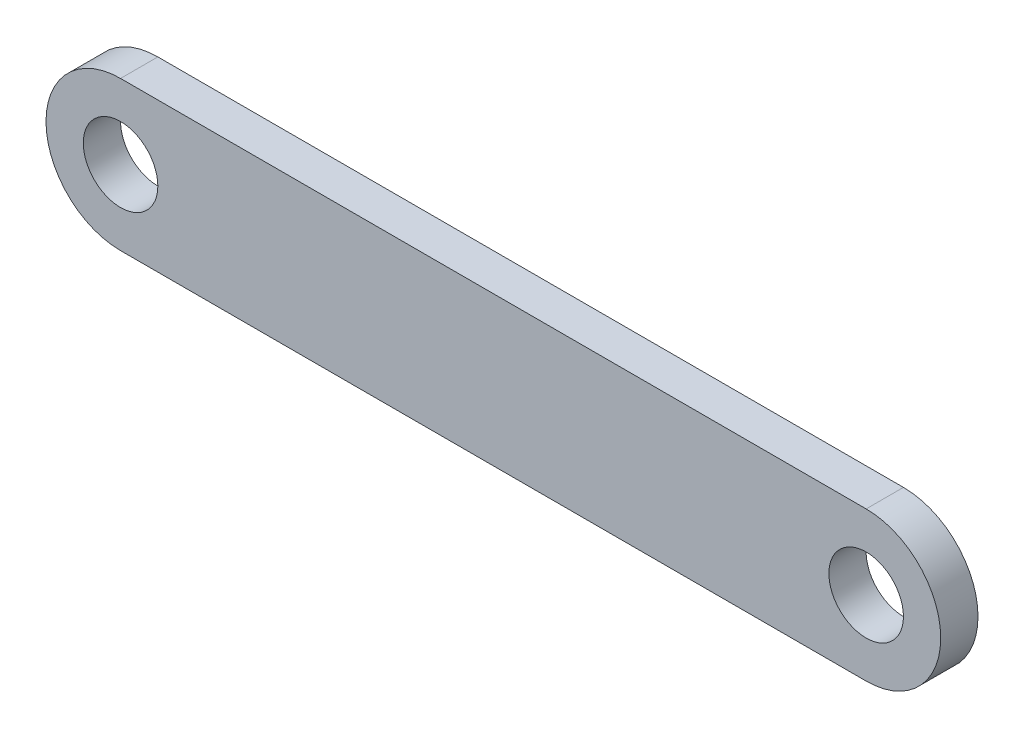
ISO-10303-21;
HEADER;
FILE_DESCRIPTION(('STEP AP214'),'2;1');
FILE_NAME('part.step','',(''),(''),'','','');
FILE_SCHEMA(('AUTOMOTIVE_DESIGN { 1 0 10303 214 1 1 1 1 }'));
ENDSEC;
DATA;
#1=APPLICATION_CONTEXT('core data for automotive mechanical design processes');
#2=APPLICATION_PROTOCOL_DEFINITION('international standard','automotive_design',2000,#1);
#3=PRODUCT_CONTEXT('',#1,'mechanical');
#4=PRODUCT('Part','Part','',(#3));
#5=PRODUCT_RELATED_PRODUCT_CATEGORY('part','',(#4));
#6=PRODUCT_DEFINITION_FORMATION('','',#4);
#7=PRODUCT_DEFINITION_CONTEXT('part definition',#1,'design');
#8=PRODUCT_DEFINITION('design','',#6,#7);
#9=PRODUCT_DEFINITION_SHAPE('','',#8);
#10=(LENGTH_UNIT() NAMED_UNIT(*) SI_UNIT(.MILLI.,.METRE.));
#11=(NAMED_UNIT(*) PLANE_ANGLE_UNIT() SI_UNIT($,.RADIAN.));
#12=(NAMED_UNIT(*) SI_UNIT($,.STERADIAN.) SOLID_ANGLE_UNIT());
#13=UNCERTAINTY_MEASURE_WITH_UNIT(LENGTH_MEASURE(1.E-05),#10,'distance_accuracy_value','');
#14=(GEOMETRIC_REPRESENTATION_CONTEXT(3) GLOBAL_UNCERTAINTY_ASSIGNED_CONTEXT((#13)) GLOBAL_UNIT_ASSIGNED_CONTEXT((#10,
#11,#12)) REPRESENTATION_CONTEXT('',''));
#15=CARTESIAN_POINT('',(0.,0.,0.));
#16=DIRECTION('',(0.,0.,1.));
#17=DIRECTION('',(1.,0.,0.));
#18=AXIS2_PLACEMENT_3D('',#15,#16,#17);
#19=CARTESIAN_POINT('',(-50.,0.,5.));
#20=DIRECTION('',(0.,0.,1.));
#21=DIRECTION('',(1.,0.,0.));
#22=AXIS2_PLACEMENT_3D('',#19,#20,#21);
#23=PLANE('',#22);
#24=CARTESIAN_POINT('',(-50.,0.,5.));
#25=DIRECTION('',(0.,0.,1.));
#26=DIRECTION('',(1.,0.,0.));
#27=AXIS2_PLACEMENT_3D('',#24,#25,#26);
#28=CIRCLE('',#27,5.);
#29=CARTESIAN_POINT('',(-45.,0.,5.));
#30=VERTEX_POINT('',#29);
#31=EDGE_CURVE('E118',#30,#30,#28,.T.);
#32=ORIENTED_EDGE('',*,*,#31,.F.);
#33=EDGE_LOOP('',(#32));
#34=FACE_BOUND('',#33,.T.);
#35=CARTESIAN_POINT('',(-50.,0.,5.));
#36=DIRECTION('',(0.,0.,1.));
#37=DIRECTION('',(1.,0.,0.));
#38=AXIS2_PLACEMENT_3D('',#35,#36,#37);
#39=CIRCLE('',#38,10.);
#40=CARTESIAN_POINT('',(-50.,10.,5.));
#41=VERTEX_POINT('',#40);
#42=CARTESIAN_POINT('',(-50.,-10.,5.));
#43=VERTEX_POINT('',#42);
#44=EDGE_CURVE('E97',#41,#43,#39,.T.);
#45=ORIENTED_EDGE('',*,*,#44,.T.);
#46=DIRECTION('',(1.,0.,0.));
#47=VECTOR('',#46,1.);
#48=CARTESIAN_POINT('',(-50.,-10.,5.));
#49=LINE('',#48,#47);
#50=CARTESIAN_POINT('',(50.,-10.,5.));
#51=VERTEX_POINT('',#50);
#52=EDGE_CURVE('E93',#43,#51,#49,.T.);
#53=ORIENTED_EDGE('',*,*,#52,.T.);
#54=CARTESIAN_POINT('',(50.,0.,5.));
#55=DIRECTION('',(0.,0.,1.));
#56=DIRECTION('',(1.,0.,0.));
#57=AXIS2_PLACEMENT_3D('',#54,#55,#56);
#58=CIRCLE('',#57,10.);
#59=CARTESIAN_POINT('',(50.,10.,5.));
#60=VERTEX_POINT('',#59);
#61=EDGE_CURVE('E96',#51,#60,#58,.T.);
#62=ORIENTED_EDGE('',*,*,#61,.T.);
#63=DIRECTION('',(-1.,0.,0.));
#64=VECTOR('',#63,1.);
#65=CARTESIAN_POINT('',(-50.,10.,5.));
#66=LINE('',#65,#64);
#67=EDGE_CURVE('E63',#60,#41,#66,.T.);
#68=ORIENTED_EDGE('',*,*,#67,.T.);
#69=EDGE_LOOP('',(#45,#53,#62,#68));
#70=FACE_BOUND('',#69,.T.);
#71=CARTESIAN_POINT('',(50.,0.,5.));
#72=DIRECTION('',(0.,0.,1.));
#73=DIRECTION('',(1.,0.,0.));
#74=AXIS2_PLACEMENT_3D('',#71,#72,#73);
#75=CIRCLE('',#74,5.);
#76=CARTESIAN_POINT('',(55.,0.,5.));
#77=VERTEX_POINT('',#76);
#78=EDGE_CURVE('E139',#77,#77,#75,.T.);
#79=ORIENTED_EDGE('',*,*,#78,.F.);
#80=EDGE_LOOP('',(#79));
#81=FACE_BOUND('',#80,.T.);
#82=ADVANCED_FACE('F44',(#34,#70,#81),#23,.T.);
#83=CARTESIAN_POINT('',(-50.,0.,0.));
#84=DIRECTION('',(0.,0.,1.));
#85=DIRECTION('',(1.,0.,0.));
#86=AXIS2_PLACEMENT_3D('',#83,#84,#85);
#87=PLANE('',#86);
#88=CARTESIAN_POINT('',(-50.,0.,0.));
#89=DIRECTION('',(0.,0.,1.));
#90=DIRECTION('',(1.,0.,0.));
#91=AXIS2_PLACEMENT_3D('',#88,#89,#90);
#92=CIRCLE('',#91,10.);
#93=CARTESIAN_POINT('',(-50.,10.,0.));
#94=VERTEX_POINT('',#93);
#95=CARTESIAN_POINT('',(-50.,-10.,0.));
#96=VERTEX_POINT('',#95);
#97=EDGE_CURVE('E114',#94,#96,#92,.T.);
#98=ORIENTED_EDGE('',*,*,#97,.F.);
#99=DIRECTION('',(-1.,0.,0.));
#100=VECTOR('',#99,1.);
#101=CARTESIAN_POINT('',(-50.,10.,0.));
#102=LINE('',#101,#100);
#103=CARTESIAN_POINT('',(50.,10.,0.));
#104=VERTEX_POINT('',#103);
#105=EDGE_CURVE('E86',#104,#94,#102,.T.);
#106=ORIENTED_EDGE('',*,*,#105,.F.);
#107=CARTESIAN_POINT('',(50.,0.,0.));
#108=DIRECTION('',(0.,0.,1.));
#109=DIRECTION('',(1.,0.,0.));
#110=AXIS2_PLACEMENT_3D('',#107,#108,#109);
#111=CIRCLE('',#110,10.);
#112=CARTESIAN_POINT('',(50.,-10.,0.));
#113=VERTEX_POINT('',#112);
#114=EDGE_CURVE('E79',#113,#104,#111,.T.);
#115=ORIENTED_EDGE('',*,*,#114,.F.);
#116=DIRECTION('',(1.,0.,0.));
#117=VECTOR('',#116,1.);
#118=CARTESIAN_POINT('',(-50.,-10.,0.));
#119=LINE('',#118,#117);
#120=EDGE_CURVE('E104',#96,#113,#119,.T.);
#121=ORIENTED_EDGE('',*,*,#120,.F.);
#122=EDGE_LOOP('',(#98,#106,#115,#121));
#123=FACE_BOUND('',#122,.T.);
#124=CARTESIAN_POINT('',(-50.,0.,0.));
#125=DIRECTION('',(0.,0.,1.));
#126=DIRECTION('',(1.,0.,0.));
#127=AXIS2_PLACEMENT_3D('',#124,#125,#126);
#128=CIRCLE('',#127,5.);
#129=CARTESIAN_POINT('',(-45.,0.,0.));
#130=VERTEX_POINT('',#129);
#131=EDGE_CURVE('E136',#130,#130,#128,.T.);
#132=ORIENTED_EDGE('',*,*,#131,.T.);
#133=EDGE_LOOP('',(#132));
#134=FACE_BOUND('',#133,.T.);
#135=CARTESIAN_POINT('',(50.,0.,0.));
#136=DIRECTION('',(0.,0.,1.));
#137=DIRECTION('',(1.,0.,0.));
#138=AXIS2_PLACEMENT_3D('',#135,#136,#137);
#139=CIRCLE('',#138,5.);
#140=CARTESIAN_POINT('',(55.,0.,0.));
#141=VERTEX_POINT('',#140);
#142=EDGE_CURVE('E143',#141,#141,#139,.T.);
#143=ORIENTED_EDGE('',*,*,#142,.T.);
#144=EDGE_LOOP('',(#143));
#145=FACE_BOUND('',#144,.T.);
#146=ADVANCED_FACE('F131',(#123,#134,#145),#87,.F.);
#147=CARTESIAN_POINT('',(-50.,0.,5.));
#148=DIRECTION('',(0.,0.,-1.));
#149=DIRECTION('',(-1.,0.,0.));
#150=AXIS2_PLACEMENT_3D('',#147,#148,#149);
#151=CYLINDRICAL_SURFACE('',#150,10.);
#152=ORIENTED_EDGE('',*,*,#97,.T.);
#153=DIRECTION('',(0.,0.,-1.));
#154=VECTOR('',#153,1.);
#155=CARTESIAN_POINT('',(-50.,-10.,5.));
#156=LINE('',#155,#154);
#157=EDGE_CURVE('E11',#43,#96,#156,.T.);
#158=ORIENTED_EDGE('',*,*,#157,.F.);
#159=ORIENTED_EDGE('',*,*,#44,.F.);
#160=DIRECTION('',(0.,0.,-1.));
#161=VECTOR('',#160,1.);
#162=CARTESIAN_POINT('',(-50.,10.,5.));
#163=LINE('',#162,#161);
#164=EDGE_CURVE('E106',#41,#94,#163,.T.);
#165=ORIENTED_EDGE('',*,*,#164,.T.);
#166=EDGE_LOOP('',(#152,#158,#159,#165));
#167=FACE_BOUND('',#166,.T.);
#168=ADVANCED_FACE('F50',(#167),#151,.T.);
#169=CARTESIAN_POINT('',(-50.,-10.,5.));
#170=DIRECTION('',(0.,1.,0.));
#171=DIRECTION('',(-1.,0.,0.));
#172=AXIS2_PLACEMENT_3D('',#169,#170,#171);
#173=PLANE('',#172);
#174=ORIENTED_EDGE('',*,*,#120,.T.);
#175=DIRECTION('',(0.,0.,-1.));
#176=VECTOR('',#175,1.);
#177=CARTESIAN_POINT('',(50.,-10.,5.));
#178=LINE('',#177,#176);
#179=EDGE_CURVE('E54',#51,#113,#178,.T.);
#180=ORIENTED_EDGE('',*,*,#179,.F.);
#181=ORIENTED_EDGE('',*,*,#52,.F.);
#182=ORIENTED_EDGE('',*,*,#157,.T.);
#183=EDGE_LOOP('',(#174,#180,#181,#182));
#184=FACE_BOUND('',#183,.T.);
#185=ADVANCED_FACE('F105',(#184),#173,.F.);
#186=CARTESIAN_POINT('',(50.,0.,5.));
#187=DIRECTION('',(0.,0.,-1.));
#188=DIRECTION('',(-1.,0.,0.));
#189=AXIS2_PLACEMENT_3D('',#186,#187,#188);
#190=CYLINDRICAL_SURFACE('',#189,10.);
#191=ORIENTED_EDGE('',*,*,#114,.T.);
#192=DIRECTION('',(0.,0.,-1.));
#193=VECTOR('',#192,1.);
#194=CARTESIAN_POINT('',(50.,10.,5.));
#195=LINE('',#194,#193);
#196=EDGE_CURVE('E103',#60,#104,#195,.T.);
#197=ORIENTED_EDGE('',*,*,#196,.F.);
#198=ORIENTED_EDGE('',*,*,#61,.F.);
#199=ORIENTED_EDGE('',*,*,#179,.T.);
#200=EDGE_LOOP('',(#191,#197,#198,#199));
#201=FACE_BOUND('',#200,.T.);
#202=ADVANCED_FACE('F107',(#201),#190,.T.);
#203=CARTESIAN_POINT('',(-50.,10.,5.));
#204=DIRECTION('',(0.,-1.,0.));
#205=DIRECTION('',(1.,0.,0.));
#206=AXIS2_PLACEMENT_3D('',#203,#204,#205);
#207=PLANE('',#206);
#208=ORIENTED_EDGE('',*,*,#105,.T.);
#209=ORIENTED_EDGE('',*,*,#164,.F.);
#210=ORIENTED_EDGE('',*,*,#67,.F.);
#211=ORIENTED_EDGE('',*,*,#196,.T.);
#212=EDGE_LOOP('',(#208,#209,#210,#211));
#213=FACE_BOUND('',#212,.T.);
#214=ADVANCED_FACE('F126',(#213),#207,.F.);
#215=CARTESIAN_POINT('',(-50.,0.,5.));
#216=DIRECTION('',(0.,0.,-1.));
#217=DIRECTION('',(-1.,0.,0.));
#218=AXIS2_PLACEMENT_3D('',#215,#216,#217);
#219=CYLINDRICAL_SURFACE('',#218,5.);
#220=ORIENTED_EDGE('',*,*,#31,.T.);
#221=EDGE_LOOP('',(#220));
#222=FACE_BOUND('',#221,.T.);
#223=ORIENTED_EDGE('',*,*,#131,.F.);
#224=EDGE_LOOP('',(#223));
#225=FACE_BOUND('',#224,.T.);
#226=ADVANCED_FACE('F163',(#222,#225),#219,.F.);
#227=CARTESIAN_POINT('',(50.,0.,5.));
#228=DIRECTION('',(0.,0.,-1.));
#229=DIRECTION('',(-1.,0.,0.));
#230=AXIS2_PLACEMENT_3D('',#227,#228,#229);
#231=CYLINDRICAL_SURFACE('',#230,5.);
#232=ORIENTED_EDGE('',*,*,#78,.T.);
#233=EDGE_LOOP('',(#232));
#234=FACE_BOUND('',#233,.T.);
#235=ORIENTED_EDGE('',*,*,#142,.F.);
#236=EDGE_LOOP('',(#235));
#237=FACE_BOUND('',#236,.T.);
#238=ADVANCED_FACE('F155',(#234,#237),#231,.F.);
#239=CLOSED_SHELL('',(#82,#146,#168,#185,#202,#214,#226,#238));
#240=MANIFOLD_SOLID_BREP('B2',#239);
#241=ADVANCED_BREP_SHAPE_REPRESENTATION('',(#18,#240),#14);
#242=SHAPE_DEFINITION_REPRESENTATION(#9,#241);
ENDSEC;
END-ISO-10303-21;
